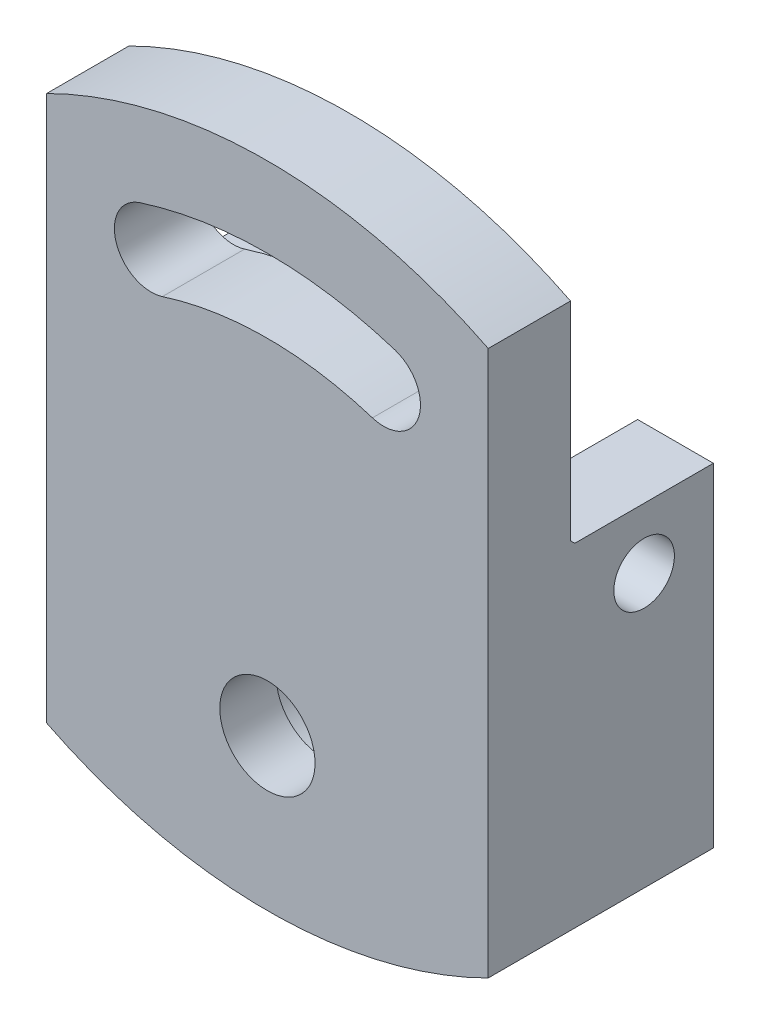
ISO-10303-21;
HEADER;
FILE_DESCRIPTION(('STEP AP214'),'2;1');
FILE_NAME('part.step','',(''),(''),'','','');
FILE_SCHEMA(('AUTOMOTIVE_DESIGN { 1 0 10303 214 1 1 1 1 }'));
ENDSEC;
DATA;
#1=APPLICATION_CONTEXT('core data for automotive mechanical design processes');
#2=APPLICATION_PROTOCOL_DEFINITION('international standard','automotive_design',2000,#1);
#3=PRODUCT_CONTEXT('',#1,'mechanical');
#4=PRODUCT('Part','Part','',(#3));
#5=PRODUCT_RELATED_PRODUCT_CATEGORY('part','',(#4));
#6=PRODUCT_DEFINITION_FORMATION('','',#4);
#7=PRODUCT_DEFINITION_CONTEXT('part definition',#1,'design');
#8=PRODUCT_DEFINITION('design','',#6,#7);
#9=PRODUCT_DEFINITION_SHAPE('','',#8);
#10=(LENGTH_UNIT() NAMED_UNIT(*) SI_UNIT(.MILLI.,.METRE.));
#11=(NAMED_UNIT(*) PLANE_ANGLE_UNIT() SI_UNIT($,.RADIAN.));
#12=(NAMED_UNIT(*) SI_UNIT($,.STERADIAN.) SOLID_ANGLE_UNIT());
#13=UNCERTAINTY_MEASURE_WITH_UNIT(LENGTH_MEASURE(1.E-05),#10,'distance_accuracy_value','');
#14=(GEOMETRIC_REPRESENTATION_CONTEXT(3) GLOBAL_UNCERTAINTY_ASSIGNED_CONTEXT((#13)) GLOBAL_UNIT_ASSIGNED_CONTEXT((#10,
#11,#12)) REPRESENTATION_CONTEXT('',''));
#15=CARTESIAN_POINT('',(0.,0.,0.));
#16=DIRECTION('',(0.,0.,1.));
#17=DIRECTION('',(1.,0.,0.));
#18=AXIS2_PLACEMENT_3D('',#15,#16,#17);
#19=CARTESIAN_POINT('',(0.,36.,10.));
#20=DIRECTION('',(0.,0.,-1.));
#21=DIRECTION('',(-1.,0.,0.));
#22=AXIS2_PLACEMENT_3D('',#19,#20,#21);
#23=PLANE('',#22);
#24=CARTESIAN_POINT('',(0.,36.,10.));
#25=DIRECTION('',(0.,0.,1.));
#26=DIRECTION('',(-1.,0.,0.));
#27=AXIS2_PLACEMENT_3D('',#24,#25,#26);
#28=CIRCLE('',#27,114.);
#29=CARTESIAN_POINT('',(51.,137.955872807799,10.));
#30=VERTEX_POINT('',#29);
#31=CARTESIAN_POINT('',(-51.,137.955872807799,10.));
#32=VERTEX_POINT('',#31);
#33=EDGE_CURVE('E303',#30,#32,#28,.T.);
#34=ORIENTED_EDGE('',*,*,#33,.T.);
#35=DIRECTION('',(0.,-1.,0.));
#36=VECTOR('',#35,1.);
#37=CARTESIAN_POINT('',(-51.,12.0441271922014,10.));
#38=LINE('',#37,#36);
#39=CARTESIAN_POINT('',(-51.,12.0441271922014,10.));
#40=VERTEX_POINT('',#39);
#41=EDGE_CURVE('E304',#32,#40,#38,.T.);
#42=ORIENTED_EDGE('',*,*,#41,.T.);
#43=CARTESIAN_POINT('',(0.,114.,10.));
#44=DIRECTION('',(0.,0.,1.));
#45=DIRECTION('',(1.,0.,0.));
#46=AXIS2_PLACEMENT_3D('',#43,#44,#45);
#47=CIRCLE('',#46,114.);
#48=CARTESIAN_POINT('',(51.,12.0441271922014,10.));
#49=VERTEX_POINT('',#48);
#50=EDGE_CURVE('E306',#40,#49,#47,.T.);
#51=ORIENTED_EDGE('',*,*,#50,.T.);
#52=DIRECTION('',(0.,1.,0.));
#53=VECTOR('',#52,1.);
#54=CARTESIAN_POINT('',(51.,137.955872807799,10.));
#55=LINE('',#54,#53);
#56=EDGE_CURVE('E313',#49,#30,#55,.T.);
#57=ORIENTED_EDGE('',*,*,#56,.T.);
#58=EDGE_LOOP('',(#34,#42,#51,#57));
#59=FACE_BOUND('',#58,.T.);
#60=CARTESIAN_POINT('',(0.,35.,10.));
#61=DIRECTION('',(0.,0.,1.));
#62=DIRECTION('',(1.,0.,0.));
#63=AXIS2_PLACEMENT_3D('',#60,#61,#62);
#64=CIRCLE('',#63,11.);
#65=CARTESIAN_POINT('',(11.,35.,10.));
#66=VERTEX_POINT('',#65);
#67=EDGE_CURVE('E218',#66,#66,#64,.T.);
#68=ORIENTED_EDGE('',*,*,#67,.F.);
#69=EDGE_LOOP('',(#68));
#70=FACE_BOUND('',#69,.T.);
#71=CARTESIAN_POINT('',(26.8440613852848,118.805706060763,10.));
#72=DIRECTION('',(0.,0.,1.));
#73=DIRECTION('',(1.,0.,0.));
#74=AXIS2_PLACEMENT_3D('',#71,#72,#73);
#75=CIRCLE('',#74,8.49999999999999);
#76=CARTESIAN_POINT('',(24.2511690923879,110.710836725349,10.));
#77=VERTEX_POINT('',#76);
#78=CARTESIAN_POINT('',(29.4369536781816,126.900575396178,10.));
#79=VERTEX_POINT('',#78);
#80=EDGE_CURVE('E175',#77,#79,#75,.T.);
#81=ORIENTED_EDGE('',*,*,#80,.F.);
#82=CARTESIAN_POINT('',(0.,35.,10.));
#83=DIRECTION('',(0.,0.,-1.));
#84=DIRECTION('',(1.,0.,0.));
#85=AXIS2_PLACEMENT_3D('',#82,#83,#84);
#86=CIRCLE('',#85,79.5);
#87=CARTESIAN_POINT('',(-24.2511690923879,110.710836725349,10.));
#88=VERTEX_POINT('',#87);
#89=EDGE_CURVE('E197',#88,#77,#86,.T.);
#90=ORIENTED_EDGE('',*,*,#89,.F.);
#91=CARTESIAN_POINT('',(-26.8440613852848,118.805706060763,10.));
#92=DIRECTION('',(0.,0.,1.));
#93=DIRECTION('',(1.,0.,0.));
#94=AXIS2_PLACEMENT_3D('',#91,#92,#93);
#95=CIRCLE('',#94,8.49999999999999);
#96=CARTESIAN_POINT('',(-29.4369536781816,126.900575396178,10.));
#97=VERTEX_POINT('',#96);
#98=EDGE_CURVE('E191',#97,#88,#95,.T.);
#99=ORIENTED_EDGE('',*,*,#98,.F.);
#100=CARTESIAN_POINT('',(0.,35.,10.));
#101=DIRECTION('',(0.,0.,1.));
#102=DIRECTION('',(1.,0.,0.));
#103=AXIS2_PLACEMENT_3D('',#100,#101,#102);
#104=CIRCLE('',#103,96.5);
#105=EDGE_CURVE('E182',#79,#97,#104,.T.);
#106=ORIENTED_EDGE('',*,*,#105,.F.);
#107=EDGE_LOOP('',(#81,#90,#99,#106));
#108=FACE_BOUND('',#107,.T.);
#109=ADVANCED_FACE('F64',(#59,#70,#108),#23,.F.);
#110=CARTESIAN_POINT('',(-51.,150.,-9.));
#111=DIRECTION('',(0.,0.,1.));
#112=DIRECTION('',(0.,-1.,0.));
#113=AXIS2_PLACEMENT_3D('',#110,#111,#112);
#114=PLANE('',#113);
#115=DIRECTION('',(0.,-1.,0.));
#116=VECTOR('',#115,1.);
#117=CARTESIAN_POINT('',(51.,150.,-9.));
#118=LINE('',#117,#116);
#119=CARTESIAN_POINT('',(51.,137.955872807799,-9.00000000000001));
#120=VERTEX_POINT('',#119);
#121=CARTESIAN_POINT('',(51.,90.,-9.00000000000001));
#122=VERTEX_POINT('',#121);
#123=EDGE_CURVE('E278',#120,#122,#118,.T.);
#124=ORIENTED_EDGE('',*,*,#123,.T.);
#125=DIRECTION('',(-1.,0.,0.));
#126=VECTOR('',#125,1.);
#127=CARTESIAN_POINT('',(-51.,90.,-9.00000000000001));
#128=LINE('',#127,#126);
#129=CARTESIAN_POINT('',(-51.,90.,-9.00000000000001));
#130=VERTEX_POINT('',#129);
#131=EDGE_CURVE('E331',#122,#130,#128,.T.);
#132=ORIENTED_EDGE('',*,*,#131,.T.);
#133=DIRECTION('',(0.,-1.,0.));
#134=VECTOR('',#133,1.);
#135=CARTESIAN_POINT('',(-51.,150.,-9.));
#136=LINE('',#135,#134);
#137=CARTESIAN_POINT('',(-51.,137.955872807799,-9.00000000000003));
#138=VERTEX_POINT('',#137);
#139=EDGE_CURVE('E295',#138,#130,#136,.T.);
#140=ORIENTED_EDGE('',*,*,#139,.F.);
#141=CARTESIAN_POINT('',(0.,36.,-9.00000000000002));
#142=DIRECTION('',(0.,0.,1.));
#143=DIRECTION('',(0.,-1.,0.));
#144=AXIS2_PLACEMENT_3D('',#141,#142,#143);
#145=CIRCLE('',#144,114.);
#146=EDGE_CURVE('E329',#120,#138,#145,.T.);
#147=ORIENTED_EDGE('',*,*,#146,.F.);
#148=EDGE_LOOP('',(#124,#132,#140,#147));
#149=FACE_BOUND('',#148,.T.);
#150=CARTESIAN_POINT('',(26.8440613852848,118.805706060763,-9.00000000000001));
#151=DIRECTION('',(0.,0.,1.));
#152=DIRECTION('',(0.,-1.,0.));
#153=AXIS2_PLACEMENT_3D('',#150,#151,#152);
#154=CIRCLE('',#153,8.49999999999999);
#155=CARTESIAN_POINT('',(29.4369536781816,126.900575396178,-9.00000000000003));
#156=VERTEX_POINT('',#155);
#157=CARTESIAN_POINT('',(24.2511690923879,110.710836725349,-9.00000000000001));
#158=VERTEX_POINT('',#157);
#159=EDGE_CURVE('E12',#156,#158,#154,.F.);
#160=ORIENTED_EDGE('',*,*,#159,.F.);
#161=CARTESIAN_POINT('',(0.,35.,-9.00000000000002));
#162=DIRECTION('',(0.,0.,1.));
#163=DIRECTION('',(0.,-1.,0.));
#164=AXIS2_PLACEMENT_3D('',#161,#162,#163);
#165=CIRCLE('',#164,96.5);
#166=CARTESIAN_POINT('',(-29.4369536781816,126.900575396178,-9.00000000000001));
#167=VERTEX_POINT('',#166);
#168=EDGE_CURVE('E73',#167,#156,#165,.F.);
#169=ORIENTED_EDGE('',*,*,#168,.F.);
#170=CARTESIAN_POINT('',(-26.8440613852848,118.805706060763,-9.00000000000001));
#171=DIRECTION('',(0.,0.,1.));
#172=DIRECTION('',(0.,-1.,0.));
#173=AXIS2_PLACEMENT_3D('',#170,#171,#172);
#174=CIRCLE('',#173,8.49999999999999);
#175=CARTESIAN_POINT('',(-24.251169092388,110.710836725349,-9.00000000000002));
#176=VERTEX_POINT('',#175);
#177=EDGE_CURVE('E363',#176,#167,#174,.F.);
#178=ORIENTED_EDGE('',*,*,#177,.F.);
#179=CARTESIAN_POINT('',(0.,35.,-9.00000000000002));
#180=DIRECTION('',(0.,0.,1.));
#181=DIRECTION('',(0.,-1.,0.));
#182=AXIS2_PLACEMENT_3D('',#179,#180,#181);
#183=CIRCLE('',#182,79.5);
#184=EDGE_CURVE('E354',#158,#176,#183,.T.);
#185=ORIENTED_EDGE('',*,*,#184,.F.);
#186=EDGE_LOOP('',(#160,#169,#178,#185));
#187=FACE_BOUND('',#186,.T.);
#188=ADVANCED_FACE('F414',(#149,#187),#114,.F.);
#189=CARTESIAN_POINT('',(145.578010129205,89.,-10.));
#190=DIRECTION('',(0.,-1.,0.));
#191=DIRECTION('',(0.,0.,-1.));
#192=AXIS2_PLACEMENT_3D('',#189,#190,#191);
#193=PLANE('',#192);
#194=DIRECTION('',(0.,0.,1.));
#195=VECTOR('',#194,1.);
#196=CARTESIAN_POINT('',(-33.5,89.,-10.));
#197=LINE('',#196,#195);
#198=CARTESIAN_POINT('',(-33.5,89.,-42.));
#199=VERTEX_POINT('',#198);
#200=CARTESIAN_POINT('',(-33.5,89.,-10.));
#201=VERTEX_POINT('',#200);
#202=EDGE_CURVE('E244',#199,#201,#197,.T.);
#203=ORIENTED_EDGE('',*,*,#202,.F.);
#204=DIRECTION('',(-1.,0.,0.));
#205=VECTOR('',#204,1.);
#206=CARTESIAN_POINT('',(145.578010129205,89.,-42.));
#207=LINE('',#206,#205);
#208=CARTESIAN_POINT('',(-51.,89.,-42.));
#209=VERTEX_POINT('',#208);
#210=EDGE_CURVE('E274',#199,#209,#207,.T.);
#211=ORIENTED_EDGE('',*,*,#210,.T.);
#212=DIRECTION('',(0.,0.,-1.));
#213=VECTOR('',#212,1.);
#214=CARTESIAN_POINT('',(-51.,89.,-10.));
#215=LINE('',#214,#213);
#216=CARTESIAN_POINT('',(-51.,89.,-10.));
#217=VERTEX_POINT('',#216);
#218=EDGE_CURVE('E271',#217,#209,#215,.T.);
#219=ORIENTED_EDGE('',*,*,#218,.F.);
#220=DIRECTION('',(1.,0.,0.));
#221=VECTOR('',#220,1.);
#222=CARTESIAN_POINT('',(-51.,89.,-10.));
#223=LINE('',#222,#221);
#224=EDGE_CURVE('E300',#217,#201,#223,.T.);
#225=ORIENTED_EDGE('',*,*,#224,.T.);
#226=EDGE_LOOP('',(#203,#211,#219,#225));
#227=FACE_BOUND('',#226,.T.);
#228=ADVANCED_FACE('F383',(#227),#193,.F.);
#229=CARTESIAN_POINT('',(145.578010129205,89.,-42.));
#230=DIRECTION('',(0.,0.,1.));
#231=DIRECTION('',(0.,-1.,0.));
#232=AXIS2_PLACEMENT_3D('',#229,#230,#231);
#233=PLANE('',#232);
#234=DIRECTION('',(0.,1.,0.));
#235=VECTOR('',#234,1.);
#236=CARTESIAN_POINT('',(-33.5,89.,-42.));
#237=LINE('',#236,#235);
#238=CARTESIAN_POINT('',(-33.5,5.03326195576929,-42.));
#239=VERTEX_POINT('',#238);
#240=EDGE_CURVE('E241',#239,#199,#237,.T.);
#241=ORIENTED_EDGE('',*,*,#240,.F.);
#242=CARTESIAN_POINT('',(0.,114.,-42.));
#243=DIRECTION('',(0.,0.,1.));
#244=DIRECTION('',(1.,0.,0.));
#245=AXIS2_PLACEMENT_3D('',#242,#243,#244);
#246=CIRCLE('',#245,114.);
#247=CARTESIAN_POINT('',(-51.,12.0441271922014,-42.));
#248=VERTEX_POINT('',#247);
#249=EDGE_CURVE('E265',#239,#248,#246,.F.);
#250=ORIENTED_EDGE('',*,*,#249,.T.);
#251=DIRECTION('',(0.,-1.,0.));
#252=VECTOR('',#251,1.);
#253=CARTESIAN_POINT('',(-51.,89.,-42.));
#254=LINE('',#253,#252);
#255=EDGE_CURVE('E270',#209,#248,#254,.T.);
#256=ORIENTED_EDGE('',*,*,#255,.F.);
#257=ORIENTED_EDGE('',*,*,#210,.F.);
#258=EDGE_LOOP('',(#241,#250,#256,#257));
#259=FACE_BOUND('',#258,.T.);
#260=ADVANCED_FACE('F371',(#259),#233,.F.);
#261=CARTESIAN_POINT('',(51.,137.955872807799,10.));
#262=DIRECTION('',(-1.,0.,0.));
#263=DIRECTION('',(0.,0.,1.));
#264=AXIS2_PLACEMENT_3D('',#261,#262,#263);
#265=PLANE('',#264);
#266=CARTESIAN_POINT('',(51.,75.,-26.));
#267=DIRECTION('',(1.,0.,0.));
#268=DIRECTION('',(0.,0.,-1.));
#269=AXIS2_PLACEMENT_3D('',#266,#267,#268);
#270=CIRCLE('',#269,7.);
#271=CARTESIAN_POINT('',(51.,75.,-33.));
#272=VERTEX_POINT('',#271);
#273=EDGE_CURVE('E224',#272,#272,#270,.T.);
#274=ORIENTED_EDGE('',*,*,#273,.F.);
#275=EDGE_LOOP('',(#274));
#276=FACE_BOUND('',#275,.T.);
#277=DIRECTION('',(0.,0.,-1.));
#278=VECTOR('',#277,1.);
#279=CARTESIAN_POINT('',(51.,12.0441271922014,10.));
#280=LINE('',#279,#278);
#281=CARTESIAN_POINT('',(51.,12.0441271922014,-42.));
#282=VERTEX_POINT('',#281);
#283=EDGE_CURVE('E318',#49,#282,#280,.T.);
#284=ORIENTED_EDGE('',*,*,#283,.T.);
#285=DIRECTION('',(0.,-1.,0.));
#286=VECTOR('',#285,1.);
#287=CARTESIAN_POINT('',(51.,89.,-42.));
#288=LINE('',#287,#286);
#289=CARTESIAN_POINT('',(51.,89.,-42.));
#290=VERTEX_POINT('',#289);
#291=EDGE_CURVE('E277',#290,#282,#288,.T.);
#292=ORIENTED_EDGE('',*,*,#291,.F.);
#293=DIRECTION('',(0.,0.,-1.));
#294=VECTOR('',#293,1.);
#295=CARTESIAN_POINT('',(51.,89.,-10.));
#296=LINE('',#295,#294);
#297=CARTESIAN_POINT('',(51.,89.,-10.));
#298=VERTEX_POINT('',#297);
#299=EDGE_CURVE('E281',#298,#290,#296,.T.);
#300=ORIENTED_EDGE('',*,*,#299,.F.);
#301=DIRECTION('',(0.,-0.707106781186548,-0.707106781186548));
#302=VECTOR('',#301,1.);
#303=CARTESIAN_POINT('',(51.,123.477936403899,24.4779364038993));
#304=LINE('',#303,#302);
#305=EDGE_CURVE('E340',#298,#122,#304,.F.);
#306=ORIENTED_EDGE('',*,*,#305,.T.);
#307=ORIENTED_EDGE('',*,*,#123,.F.);
#308=DIRECTION('',(0.,0.,-1.));
#309=VECTOR('',#308,1.);
#310=CARTESIAN_POINT('',(51.,137.955872807799,10.));
#311=LINE('',#310,#309);
#312=EDGE_CURVE('E314',#30,#120,#311,.T.);
#313=ORIENTED_EDGE('',*,*,#312,.F.);
#314=ORIENTED_EDGE('',*,*,#56,.F.);
#315=EDGE_LOOP('',(#284,#292,#300,#306,#307,#313,#314));
#316=FACE_BOUND('',#315,.T.);
#317=ADVANCED_FACE('F403',(#276,#316),#265,.F.);
#318=CARTESIAN_POINT('',(33.5,5.03326195576929,-42.));
#319=VERTEX_POINT('',#318);
#320=EDGE_CURVE('E263',#282,#319,#246,.F.);
#321=ORIENTED_EDGE('',*,*,#320,.T.);
#322=DIRECTION('',(0.,1.,0.));
#323=VECTOR('',#322,1.);
#324=CARTESIAN_POINT('',(33.5,89.,-42.));
#325=LINE('',#324,#323);
#326=CARTESIAN_POINT('',(33.5,89.,-42.));
#327=VERTEX_POINT('',#326);
#328=EDGE_CURVE('E251',#319,#327,#325,.T.);
#329=ORIENTED_EDGE('',*,*,#328,.T.);
#330=EDGE_CURVE('E285',#290,#327,#207,.T.);
#331=ORIENTED_EDGE('',*,*,#330,.F.);
#332=ORIENTED_EDGE('',*,*,#291,.T.);
#333=EDGE_LOOP('',(#321,#329,#331,#332));
#334=FACE_BOUND('',#333,.T.);
#335=ADVANCED_FACE('F405',(#334),#233,.F.);
#336=CARTESIAN_POINT('',(0.,36.,10.));
#337=DIRECTION('',(0.,0.,-1.));
#338=DIRECTION('',(-1.,0.,0.));
#339=AXIS2_PLACEMENT_3D('',#336,#337,#338);
#340=CYLINDRICAL_SURFACE('',#339,114.);
#341=ORIENTED_EDGE('',*,*,#312,.T.);
#342=ORIENTED_EDGE('',*,*,#146,.T.);
#343=DIRECTION('',(0.,0.,-1.));
#344=VECTOR('',#343,1.);
#345=CARTESIAN_POINT('',(-51.,137.955872807799,10.));
#346=LINE('',#345,#344);
#347=EDGE_CURVE('E326',#32,#138,#346,.T.);
#348=ORIENTED_EDGE('',*,*,#347,.F.);
#349=ORIENTED_EDGE('',*,*,#33,.F.);
#350=EDGE_LOOP('',(#341,#342,#348,#349));
#351=FACE_BOUND('',#350,.T.);
#352=ADVANCED_FACE('F411',(#351),#340,.T.);
#353=CARTESIAN_POINT('',(-51.,12.0441271922014,10.));
#354=DIRECTION('',(1.,0.,0.));
#355=DIRECTION('',(0.,0.,-1.));
#356=AXIS2_PLACEMENT_3D('',#353,#354,#355);
#357=PLANE('',#356);
#358=CARTESIAN_POINT('',(-51.,75.,-26.));
#359=DIRECTION('',(1.,0.,0.));
#360=DIRECTION('',(0.,0.,-1.));
#361=AXIS2_PLACEMENT_3D('',#358,#359,#360);
#362=CIRCLE('',#361,7.);
#363=CARTESIAN_POINT('',(-51.,75.,-33.));
#364=VERTEX_POINT('',#363);
#365=EDGE_CURVE('E230',#364,#364,#362,.T.);
#366=ORIENTED_EDGE('',*,*,#365,.T.);
#367=EDGE_LOOP('',(#366));
#368=FACE_BOUND('',#367,.T.);
#369=ORIENTED_EDGE('',*,*,#255,.T.);
#370=DIRECTION('',(0.,0.,-1.));
#371=VECTOR('',#370,1.);
#372=CARTESIAN_POINT('',(-51.,12.0441271922014,10.));
#373=LINE('',#372,#371);
#374=EDGE_CURVE('E325',#40,#248,#373,.T.);
#375=ORIENTED_EDGE('',*,*,#374,.F.);
#376=ORIENTED_EDGE('',*,*,#41,.F.);
#377=ORIENTED_EDGE('',*,*,#347,.T.);
#378=ORIENTED_EDGE('',*,*,#139,.T.);
#379=DIRECTION('',(0.,0.707106781186548,0.707106781186548));
#380=VECTOR('',#379,1.);
#381=CARTESIAN_POINT('',(-51.,60.5220635961007,-38.4779364038993));
#382=LINE('',#381,#380);
#383=EDGE_CURVE('E339',#130,#217,#382,.F.);
#384=ORIENTED_EDGE('',*,*,#383,.T.);
#385=ORIENTED_EDGE('',*,*,#218,.T.);
#386=EDGE_LOOP('',(#369,#375,#376,#377,#378,#384,#385));
#387=FACE_BOUND('',#386,.T.);
#388=ADVANCED_FACE('F377',(#368,#387),#357,.F.);
#389=CARTESIAN_POINT('',(0.,114.,10.));
#390=DIRECTION('',(0.,0.,-1.));
#391=DIRECTION('',(-1.,0.,0.));
#392=AXIS2_PLACEMENT_3D('',#389,#390,#391);
#393=CYLINDRICAL_SURFACE('',#392,114.);
#394=ORIENTED_EDGE('',*,*,#249,.F.);
#395=DIRECTION('',(0.,0.,-1.));
#396=VECTOR('',#395,1.);
#397=CARTESIAN_POINT('',(-33.5,5.03326195576929,10.));
#398=LINE('',#397,#396);
#399=CARTESIAN_POINT('',(-33.5,5.03326195576929,-10.));
#400=VERTEX_POINT('',#399);
#401=EDGE_CURVE('E351',#239,#400,#398,.F.);
#402=ORIENTED_EDGE('',*,*,#401,.T.);
#403=CARTESIAN_POINT('',(0.,114.,-10.));
#404=DIRECTION('',(0.,0.,1.));
#405=DIRECTION('',(1.,0.,0.));
#406=AXIS2_PLACEMENT_3D('',#403,#404,#405);
#407=CIRCLE('',#406,114.);
#408=CARTESIAN_POINT('',(33.5,5.03326195576929,-10.));
#409=VERTEX_POINT('',#408);
#410=EDGE_CURVE('E350',#400,#409,#407,.T.);
#411=ORIENTED_EDGE('',*,*,#410,.T.);
#412=DIRECTION('',(0.,0.,-1.));
#413=VECTOR('',#412,1.);
#414=CARTESIAN_POINT('',(33.5,5.03326195576929,10.));
#415=LINE('',#414,#413);
#416=EDGE_CURVE('E342',#319,#409,#415,.F.);
#417=ORIENTED_EDGE('',*,*,#416,.F.);
#418=ORIENTED_EDGE('',*,*,#320,.F.);
#419=ORIENTED_EDGE('',*,*,#283,.F.);
#420=ORIENTED_EDGE('',*,*,#50,.F.);
#421=ORIENTED_EDGE('',*,*,#374,.T.);
#422=EDGE_LOOP('',(#394,#402,#411,#417,#418,#419,#420,#421));
#423=FACE_BOUND('',#422,.T.);
#424=ADVANCED_FACE('F376',(#423),#393,.T.);
#425=CARTESIAN_POINT('',(-51.,89.,-9.99999999999998));
#426=DIRECTION('',(0.,0.707106781186548,-0.707106781186548));
#427=DIRECTION('',(-1.,0.,0.));
#428=AXIS2_PLACEMENT_3D('',#425,#426,#427);
#429=PLANE('',#428);
#430=ORIENTED_EDGE('',*,*,#383,.F.);
#431=ORIENTED_EDGE('',*,*,#131,.F.);
#432=ORIENTED_EDGE('',*,*,#305,.F.);
#433=CARTESIAN_POINT('',(33.5,89.,-10.));
#434=VERTEX_POINT('',#433);
#435=EDGE_CURVE('E296',#434,#298,#223,.T.);
#436=ORIENTED_EDGE('',*,*,#435,.F.);
#437=DIRECTION('',(1.,0.,0.));
#438=VECTOR('',#437,1.);
#439=CARTESIAN_POINT('',(-33.5,89.,-10.));
#440=LINE('',#439,#438);
#441=EDGE_CURVE('E247',#201,#434,#440,.T.);
#442=ORIENTED_EDGE('',*,*,#441,.F.);
#443=ORIENTED_EDGE('',*,*,#224,.F.);
#444=EDGE_LOOP('',(#430,#431,#432,#436,#442,#443));
#445=FACE_BOUND('',#444,.T.);
#446=ADVANCED_FACE('F66',(#445),#429,.T.);
#447=ORIENTED_EDGE('',*,*,#330,.T.);
#448=DIRECTION('',(0.,0.,1.));
#449=VECTOR('',#448,1.);
#450=CARTESIAN_POINT('',(33.5,89.,-10.));
#451=LINE('',#450,#449);
#452=EDGE_CURVE('E245',#327,#434,#451,.T.);
#453=ORIENTED_EDGE('',*,*,#452,.T.);
#454=ORIENTED_EDGE('',*,*,#435,.T.);
#455=ORIENTED_EDGE('',*,*,#299,.T.);
#456=EDGE_LOOP('',(#447,#453,#454,#455));
#457=FACE_BOUND('',#456,.T.);
#458=ADVANCED_FACE('F396',(#457),#193,.F.);
#459=CARTESIAN_POINT('',(-33.5,0.,-10.));
#460=DIRECTION('',(0.,0.,1.));
#461=DIRECTION('',(1.,0.,0.));
#462=AXIS2_PLACEMENT_3D('',#459,#460,#461);
#463=PLANE('',#462);
#464=CARTESIAN_POINT('',(0.,35.,-10.));
#465=DIRECTION('',(0.,0.,1.));
#466=DIRECTION('',(1.,0.,0.));
#467=AXIS2_PLACEMENT_3D('',#464,#465,#466);
#468=CIRCLE('',#467,15.);
#469=CARTESIAN_POINT('',(15.,35.,-10.));
#470=VERTEX_POINT('',#469);
#471=EDGE_CURVE('E188',#470,#470,#468,.T.);
#472=ORIENTED_EDGE('',*,*,#471,.T.);
#473=EDGE_LOOP('',(#472));
#474=FACE_BOUND('',#473,.T.);
#475=DIRECTION('',(0.,-1.,0.));
#476=VECTOR('',#475,1.);
#477=CARTESIAN_POINT('',(-33.5,0.,-10.));
#478=LINE('',#477,#476);
#479=EDGE_CURVE('E240',#201,#400,#478,.T.);
#480=ORIENTED_EDGE('',*,*,#479,.F.);
#481=ORIENTED_EDGE('',*,*,#441,.T.);
#482=DIRECTION('',(0.,-1.,0.));
#483=VECTOR('',#482,1.);
#484=CARTESIAN_POINT('',(33.5,0.,-10.));
#485=LINE('',#484,#483);
#486=EDGE_CURVE('E237',#434,#409,#485,.T.);
#487=ORIENTED_EDGE('',*,*,#486,.T.);
#488=ORIENTED_EDGE('',*,*,#410,.F.);
#489=EDGE_LOOP('',(#480,#481,#487,#488));
#490=FACE_BOUND('',#489,.T.);
#491=ADVANCED_FACE('F392',(#474,#490),#463,.F.);
#492=CARTESIAN_POINT('',(-33.5,0.,0.));
#493=DIRECTION('',(-1.,0.,0.));
#494=DIRECTION('',(0.,0.,1.));
#495=AXIS2_PLACEMENT_3D('',#492,#493,#494);
#496=PLANE('',#495);
#497=CARTESIAN_POINT('',(-33.5,75.,-26.));
#498=DIRECTION('',(-1.,0.,0.));
#499=DIRECTION('',(0.,0.,1.));
#500=AXIS2_PLACEMENT_3D('',#497,#498,#499);
#501=CIRCLE('',#500,7.);
#502=CARTESIAN_POINT('',(-33.5,75.,-19.));
#503=VERTEX_POINT('',#502);
#504=EDGE_CURVE('E235',#503,#503,#501,.T.);
#505=ORIENTED_EDGE('',*,*,#504,.T.);
#506=EDGE_LOOP('',(#505));
#507=FACE_BOUND('',#506,.T.);
#508=ORIENTED_EDGE('',*,*,#240,.T.);
#509=ORIENTED_EDGE('',*,*,#202,.T.);
#510=ORIENTED_EDGE('',*,*,#479,.T.);
#511=ORIENTED_EDGE('',*,*,#401,.F.);
#512=EDGE_LOOP('',(#508,#509,#510,#511));
#513=FACE_BOUND('',#512,.T.);
#514=ADVANCED_FACE('F390',(#507,#513),#496,.F.);
#515=CARTESIAN_POINT('',(33.5,0.,0.));
#516=DIRECTION('',(-1.,0.,0.));
#517=DIRECTION('',(0.,0.,1.));
#518=AXIS2_PLACEMENT_3D('',#515,#516,#517);
#519=PLANE('',#518);
#520=CARTESIAN_POINT('',(33.5,75.,-26.));
#521=DIRECTION('',(-1.,0.,0.));
#522=DIRECTION('',(0.,0.,1.));
#523=AXIS2_PLACEMENT_3D('',#520,#521,#522);
#524=CIRCLE('',#523,7.);
#525=CARTESIAN_POINT('',(33.5,75.,-19.));
#526=VERTEX_POINT('',#525);
#527=EDGE_CURVE('E233',#526,#526,#524,.T.);
#528=ORIENTED_EDGE('',*,*,#527,.F.);
#529=EDGE_LOOP('',(#528));
#530=FACE_BOUND('',#529,.T.);
#531=ORIENTED_EDGE('',*,*,#416,.T.);
#532=ORIENTED_EDGE('',*,*,#486,.F.);
#533=ORIENTED_EDGE('',*,*,#452,.F.);
#534=ORIENTED_EDGE('',*,*,#328,.F.);
#535=EDGE_LOOP('',(#531,#532,#533,#534));
#536=FACE_BOUND('',#535,.T.);
#537=ADVANCED_FACE('F394',(#530,#536),#519,.T.);
#538=CARTESIAN_POINT('',(-51.,75.,-26.));
#539=DIRECTION('',(1.,0.,0.));
#540=DIRECTION('',(0.,0.,-1.));
#541=AXIS2_PLACEMENT_3D('',#538,#539,#540);
#542=CYLINDRICAL_SURFACE('',#541,7.);
#543=ORIENTED_EDGE('',*,*,#527,.T.);
#544=EDGE_LOOP('',(#543));
#545=FACE_BOUND('',#544,.T.);
#546=ORIENTED_EDGE('',*,*,#273,.T.);
#547=EDGE_LOOP('',(#546));
#548=FACE_BOUND('',#547,.T.);
#549=ADVANCED_FACE('F514',(#545,#548),#542,.F.);
#550=ORIENTED_EDGE('',*,*,#365,.F.);
#551=EDGE_LOOP('',(#550));
#552=FACE_BOUND('',#551,.T.);
#553=ORIENTED_EDGE('',*,*,#504,.F.);
#554=EDGE_LOOP('',(#553));
#555=FACE_BOUND('',#554,.T.);
#556=ADVANCED_FACE('F522',(#552,#555),#542,.F.);
#557=CARTESIAN_POINT('',(0.,35.,10.));
#558=DIRECTION('',(0.,0.,1.));
#559=DIRECTION('',(1.,0.,0.));
#560=AXIS2_PLACEMENT_3D('',#557,#558,#559);
#561=CYLINDRICAL_SURFACE('',#560,11.);
#562=ORIENTED_EDGE('',*,*,#67,.T.);
#563=EDGE_LOOP('',(#562));
#564=FACE_BOUND('',#563,.T.);
#565=CARTESIAN_POINT('',(0.,35.,-3.));
#566=DIRECTION('',(0.,0.,1.));
#567=DIRECTION('',(1.,0.,0.));
#568=AXIS2_PLACEMENT_3D('',#565,#566,#567);
#569=CIRCLE('',#568,11.);
#570=CARTESIAN_POINT('',(11.,35.,-3.));
#571=VERTEX_POINT('',#570);
#572=EDGE_CURVE('E214',#571,#571,#569,.T.);
#573=ORIENTED_EDGE('',*,*,#572,.F.);
#574=EDGE_LOOP('',(#573));
#575=FACE_BOUND('',#574,.T.);
#576=ADVANCED_FACE('F531',(#564,#575),#561,.F.);
#577=CARTESIAN_POINT('',(0.,46.,-3.));
#578=DIRECTION('',(0.,0.,-1.));
#579=DIRECTION('',(-1.,0.,0.));
#580=AXIS2_PLACEMENT_3D('',#577,#578,#579);
#581=PLANE('',#580);
#582=ORIENTED_EDGE('',*,*,#572,.T.);
#583=EDGE_LOOP('',(#582));
#584=FACE_BOUND('',#583,.T.);
#585=CARTESIAN_POINT('',(0.,35.,-3.));
#586=DIRECTION('',(0.,0.,1.));
#587=DIRECTION('',(1.,0.,0.));
#588=AXIS2_PLACEMENT_3D('',#585,#586,#587);
#589=CIRCLE('',#588,15.);
#590=CARTESIAN_POINT('',(15.,35.,-3.));
#591=VERTEX_POINT('',#590);
#592=EDGE_CURVE('E211',#591,#591,#589,.T.);
#593=ORIENTED_EDGE('',*,*,#592,.F.);
#594=EDGE_LOOP('',(#593));
#595=FACE_BOUND('',#594,.T.);
#596=ADVANCED_FACE('F541',(#584,#595),#581,.T.);
#597=CARTESIAN_POINT('',(0.,35.,10.));
#598=DIRECTION('',(0.,0.,1.));
#599=DIRECTION('',(1.,0.,0.));
#600=AXIS2_PLACEMENT_3D('',#597,#598,#599);
#601=CYLINDRICAL_SURFACE('',#600,15.);
#602=ORIENTED_EDGE('',*,*,#592,.T.);
#603=EDGE_LOOP('',(#602));
#604=FACE_BOUND('',#603,.T.);
#605=ORIENTED_EDGE('',*,*,#471,.F.);
#606=EDGE_LOOP('',(#605));
#607=FACE_BOUND('',#606,.T.);
#608=ADVANCED_FACE('F552',(#604,#607),#601,.F.);
#609=CARTESIAN_POINT('',(26.8440613852848,118.805706060763,10.));
#610=DIRECTION('',(0.,0.,-1.));
#611=DIRECTION('',(-1.,0.,0.));
#612=AXIS2_PLACEMENT_3D('',#609,#610,#611);
#613=CYLINDRICAL_SURFACE('',#612,8.49999999999999);
#614=ORIENTED_EDGE('',*,*,#159,.T.);
#615=DIRECTION('',(0.,0.,-1.));
#616=VECTOR('',#615,1.);
#617=CARTESIAN_POINT('',(24.2511690923879,110.710836725349,10.));
#618=LINE('',#617,#616);
#619=EDGE_CURVE('E87',#77,#158,#618,.T.);
#620=ORIENTED_EDGE('',*,*,#619,.F.);
#621=ORIENTED_EDGE('',*,*,#80,.T.);
#622=DIRECTION('',(0.,0.,-1.));
#623=VECTOR('',#622,1.);
#624=CARTESIAN_POINT('',(29.4369536781816,126.900575396178,10.));
#625=LINE('',#624,#623);
#626=EDGE_CURVE('E174',#79,#156,#625,.T.);
#627=ORIENTED_EDGE('',*,*,#626,.T.);
#628=EDGE_LOOP('',(#614,#620,#621,#627));
#629=FACE_BOUND('',#628,.T.);
#630=ADVANCED_FACE('F173',(#629),#613,.F.);
#631=CARTESIAN_POINT('',(0.,35.,10.));
#632=DIRECTION('',(0.,0.,-1.));
#633=DIRECTION('',(-1.,0.,0.));
#634=AXIS2_PLACEMENT_3D('',#631,#632,#633);
#635=CYLINDRICAL_SURFACE('',#634,96.5);
#636=ORIENTED_EDGE('',*,*,#168,.T.);
#637=ORIENTED_EDGE('',*,*,#626,.F.);
#638=ORIENTED_EDGE('',*,*,#105,.T.);
#639=DIRECTION('',(0.,0.,-1.));
#640=VECTOR('',#639,1.);
#641=CARTESIAN_POINT('',(-29.4369536781816,126.900575396178,10.));
#642=LINE('',#641,#640);
#643=EDGE_CURVE('E189',#97,#167,#642,.T.);
#644=ORIENTED_EDGE('',*,*,#643,.T.);
#645=EDGE_LOOP('',(#636,#637,#638,#644));
#646=FACE_BOUND('',#645,.T.);
#647=ADVANCED_FACE('F184',(#646),#635,.F.);
#648=CARTESIAN_POINT('',(-26.8440613852848,118.805706060763,10.));
#649=DIRECTION('',(0.,0.,-1.));
#650=DIRECTION('',(-1.,0.,0.));
#651=AXIS2_PLACEMENT_3D('',#648,#649,#650);
#652=CYLINDRICAL_SURFACE('',#651,8.49999999999999);
#653=ORIENTED_EDGE('',*,*,#177,.T.);
#654=ORIENTED_EDGE('',*,*,#643,.F.);
#655=ORIENTED_EDGE('',*,*,#98,.T.);
#656=DIRECTION('',(0.,0.,-1.));
#657=VECTOR('',#656,1.);
#658=CARTESIAN_POINT('',(-24.251169092388,110.710836725349,10.));
#659=LINE('',#658,#657);
#660=EDGE_CURVE('E85',#88,#176,#659,.T.);
#661=ORIENTED_EDGE('',*,*,#660,.T.);
#662=EDGE_LOOP('',(#653,#654,#655,#661));
#663=FACE_BOUND('',#662,.T.);
#664=ADVANCED_FACE('F424',(#663),#652,.F.);
#665=CARTESIAN_POINT('',(0.,35.,10.));
#666=DIRECTION('',(0.,0.,-1.));
#667=DIRECTION('',(-1.,0.,0.));
#668=AXIS2_PLACEMENT_3D('',#665,#666,#667);
#669=CYLINDRICAL_SURFACE('',#668,79.5);
#670=ORIENTED_EDGE('',*,*,#184,.T.);
#671=ORIENTED_EDGE('',*,*,#660,.F.);
#672=ORIENTED_EDGE('',*,*,#89,.T.);
#673=ORIENTED_EDGE('',*,*,#619,.T.);
#674=EDGE_LOOP('',(#670,#671,#672,#673));
#675=FACE_BOUND('',#674,.T.);
#676=ADVANCED_FACE('F425',(#675),#669,.T.);
#677=CLOSED_SHELL('',(#109,#188,#228,#260,#317,#335,#352,#388,#424,#446,#458,#491,#514,#537,
#549,#556,#576,#596,#608,#630,#647,#664,#676));
#678=MANIFOLD_SOLID_BREP('B2',#677);
#679=ADVANCED_BREP_SHAPE_REPRESENTATION('',(#18,#678),#14);
#680=SHAPE_DEFINITION_REPRESENTATION(#9,#679);
ENDSEC;
END-ISO-10303-21;
